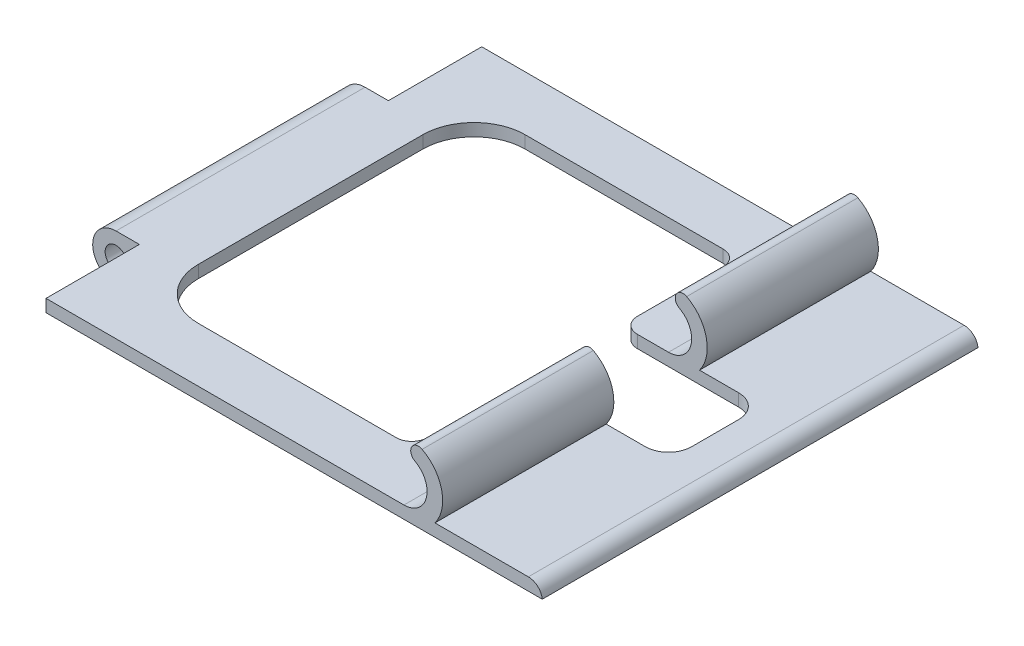
ISO-10303-21;
HEADER;
FILE_DESCRIPTION(('STEP AP214'),'2;1');
FILE_NAME('part.step','',(''),(''),'','','');
FILE_SCHEMA(('AUTOMOTIVE_DESIGN { 1 0 10303 214 1 1 1 1 }'));
ENDSEC;
DATA;
#1=APPLICATION_CONTEXT('core data for automotive mechanical design processes');
#2=APPLICATION_PROTOCOL_DEFINITION('international standard','automotive_design',2000,#1);
#3=PRODUCT_CONTEXT('',#1,'mechanical');
#4=PRODUCT('Part','Part','',(#3));
#5=PRODUCT_RELATED_PRODUCT_CATEGORY('part','',(#4));
#6=PRODUCT_DEFINITION_FORMATION('','',#4);
#7=PRODUCT_DEFINITION_CONTEXT('part definition',#1,'design');
#8=PRODUCT_DEFINITION('design','',#6,#7);
#9=PRODUCT_DEFINITION_SHAPE('','',#8);
#10=(LENGTH_UNIT() NAMED_UNIT(*) SI_UNIT(.MILLI.,.METRE.));
#11=(NAMED_UNIT(*) PLANE_ANGLE_UNIT() SI_UNIT($,.RADIAN.));
#12=(NAMED_UNIT(*) SI_UNIT($,.STERADIAN.) SOLID_ANGLE_UNIT());
#13=UNCERTAINTY_MEASURE_WITH_UNIT(LENGTH_MEASURE(1.E-05),#10,'distance_accuracy_value','');
#14=(GEOMETRIC_REPRESENTATION_CONTEXT(3) GLOBAL_UNCERTAINTY_ASSIGNED_CONTEXT((#13)) GLOBAL_UNIT_ASSIGNED_CONTEXT((#10,
#11,#12)) REPRESENTATION_CONTEXT('',''));
#15=CARTESIAN_POINT('',(0.,0.,0.));
#16=DIRECTION('',(0.,0.,1.));
#17=DIRECTION('',(1.,0.,0.));
#18=AXIS2_PLACEMENT_3D('',#15,#16,#17);
#19=CARTESIAN_POINT('',(115.,4.00000000000002,-140.));
#20=DIRECTION('',(0.,1.,0.));
#21=DIRECTION('',(-1.,0.,0.));
#22=AXIS2_PLACEMENT_3D('',#19,#20,#21);
#23=PLANE('',#22);
#24=DIRECTION('',(-1.,0.,0.));
#25=VECTOR('',#24,1.);
#26=CARTESIAN_POINT('',(115.,4.00000000000002,-85.));
#27=LINE('',#26,#25);
#28=CARTESIAN_POINT('',(115.,4.00000000000002,-85.));
#29=VERTEX_POINT('',#28);
#30=CARTESIAN_POINT('',(105.,4.00000000000001,-85.));
#31=VERTEX_POINT('',#30);
#32=EDGE_CURVE('E309',#29,#31,#27,.T.);
#33=ORIENTED_EDGE('',*,*,#32,.F.);
#34=DIRECTION('',(0.,0.,1.));
#35=VECTOR('',#34,1.);
#36=CARTESIAN_POINT('',(115.,4.00000000000002,-140.));
#37=LINE('',#36,#35);
#38=CARTESIAN_POINT('',(115.,4.00000000000002,-140.));
#39=VERTEX_POINT('',#38);
#40=EDGE_CURVE('E390',#39,#29,#37,.T.);
#41=ORIENTED_EDGE('',*,*,#40,.F.);
#42=DIRECTION('',(-1.,0.,0.));
#43=VECTOR('',#42,1.);
#44=CARTESIAN_POINT('',(0.,4.,-140.));
#45=LINE('',#44,#43);
#46=CARTESIAN_POINT('',(0.,4.,-140.));
#47=VERTEX_POINT('',#46);
#48=EDGE_CURVE('E350',#39,#47,#45,.T.);
#49=ORIENTED_EDGE('',*,*,#48,.T.);
#50=DIRECTION('',(0.,0.,1.));
#51=VECTOR('',#50,1.);
#52=CARTESIAN_POINT('',(0.,4.,-140.));
#53=LINE('',#52,#51);
#54=CARTESIAN_POINT('',(0.,3.99999999999999,-110.));
#55=VERTEX_POINT('',#54);
#56=EDGE_CURVE('E346',#47,#55,#53,.T.);
#57=ORIENTED_EDGE('',*,*,#56,.T.);
#58=DIRECTION('',(1.,0.,0.));
#59=VECTOR('',#58,1.);
#60=CARTESIAN_POINT('',(115.,4.00000000000002,-110.));
#61=LINE('',#60,#59);
#62=CARTESIAN_POINT('',(-7.5,4.,-110.));
#63=VERTEX_POINT('',#62);
#64=EDGE_CURVE('E326',#63,#55,#61,.T.);
#65=ORIENTED_EDGE('',*,*,#64,.F.);
#66=DIRECTION('',(0.,0.,1.));
#67=VECTOR('',#66,1.);
#68=CARTESIAN_POINT('',(-7.5,4.,-140.));
#69=LINE('',#68,#67);
#70=CARTESIAN_POINT('',(-7.5,4.,-30.));
#71=VERTEX_POINT('',#70);
#72=EDGE_CURVE('E371',#63,#71,#69,.T.);
#73=ORIENTED_EDGE('',*,*,#72,.T.);
#74=DIRECTION('',(-1.,0.,0.));
#75=VECTOR('',#74,1.);
#76=CARTESIAN_POINT('',(115.,4.00000000000002,-30.));
#77=LINE('',#76,#75);
#78=CARTESIAN_POINT('',(0.,3.99999999999999,-30.));
#79=VERTEX_POINT('',#78);
#80=EDGE_CURVE('E335',#79,#71,#77,.T.);
#81=ORIENTED_EDGE('',*,*,#80,.F.);
#82=DIRECTION('',(0.,0.,-1.));
#83=VECTOR('',#82,1.);
#84=CARTESIAN_POINT('',(0.,4.,-140.));
#85=LINE('',#84,#83);
#86=CARTESIAN_POINT('',(0.,4.00000000000001,0.));
#87=VERTEX_POINT('',#86);
#88=EDGE_CURVE('E341',#87,#79,#85,.T.);
#89=ORIENTED_EDGE('',*,*,#88,.F.);
#90=DIRECTION('',(-1.,0.,0.));
#91=VECTOR('',#90,1.);
#92=CARTESIAN_POINT('',(115.,4.00000000000002,0.));
#93=LINE('',#92,#91);
#94=CARTESIAN_POINT('',(115.,4.00000000000002,0.));
#95=VERTEX_POINT('',#94);
#96=EDGE_CURVE('E354',#95,#87,#93,.T.);
#97=ORIENTED_EDGE('',*,*,#96,.F.);
#98=CARTESIAN_POINT('',(115.,4.00000000000002,-55.));
#99=VERTEX_POINT('',#98);
#100=EDGE_CURVE('E394',#99,#95,#37,.T.);
#101=ORIENTED_EDGE('',*,*,#100,.F.);
#102=DIRECTION('',(1.,0.,0.));
#103=VECTOR('',#102,1.);
#104=CARTESIAN_POINT('',(115.,4.00000000000002,-55.));
#105=LINE('',#104,#103);
#106=CARTESIAN_POINT('',(105.,4.00000000000001,-55.));
#107=VERTEX_POINT('',#106);
#108=EDGE_CURVE('E292',#107,#99,#105,.T.);
#109=ORIENTED_EDGE('',*,*,#108,.F.);
#110=CARTESIAN_POINT('',(105.,4.00000000000002,-50.));
#111=DIRECTION('',(0.,1.,0.));
#112=DIRECTION('',(-1.,0.,0.));
#113=AXIS2_PLACEMENT_3D('',#110,#111,#112);
#114=CIRCLE('',#113,5.);
#115=CARTESIAN_POINT('',(100.,4.00000000000001,-50.));
#116=VERTEX_POINT('',#115);
#117=EDGE_CURVE('E283',#116,#107,#114,.F.);
#118=ORIENTED_EDGE('',*,*,#117,.F.);
#119=DIRECTION('',(0.,0.,-1.));
#120=VECTOR('',#119,1.);
#121=CARTESIAN_POINT('',(100.,4.00000000000002,-140.));
#122=LINE('',#121,#120);
#123=CARTESIAN_POINT('',(100.,4.00000000000001,-22.4400765317055));
#124=VERTEX_POINT('',#123);
#125=EDGE_CURVE('E281',#124,#116,#122,.T.);
#126=ORIENTED_EDGE('',*,*,#125,.F.);
#127=CARTESIAN_POINT('',(95.0599234682945,4.00000000000002,-22.4400765317055));
#128=DIRECTION('',(0.,1.,0.));
#129=DIRECTION('',(-1.,0.,0.));
#130=AXIS2_PLACEMENT_3D('',#127,#128,#129);
#131=CIRCLE('',#130,4.9400765317055);
#132=CARTESIAN_POINT('',(95.0599234682945,4.00000000000001,-17.5));
#133=VERTEX_POINT('',#132);
#134=EDGE_CURVE('E279',#133,#124,#131,.T.);
#135=ORIENTED_EDGE('',*,*,#134,.F.);
#136=DIRECTION('',(1.,0.,0.));
#137=VECTOR('',#136,1.);
#138=CARTESIAN_POINT('',(115.,4.00000000000002,-17.5));
#139=LINE('',#138,#137);
#140=CARTESIAN_POINT('',(31.4428038717873,4.,-17.5));
#141=VERTEX_POINT('',#140);
#142=EDGE_CURVE('E277',#141,#133,#139,.T.);
#143=ORIENTED_EDGE('',*,*,#142,.F.);
#144=CARTESIAN_POINT('',(31.4428038717873,4.00000000000001,-33.9428038717873));
#145=DIRECTION('',(0.,1.,0.));
#146=DIRECTION('',(-1.,0.,0.));
#147=AXIS2_PLACEMENT_3D('',#144,#145,#146);
#148=CIRCLE('',#147,16.4428038717873);
#149=CARTESIAN_POINT('',(15.,4.,-33.9428038717873));
#150=VERTEX_POINT('',#149);
#151=EDGE_CURVE('E275',#150,#141,#148,.T.);
#152=ORIENTED_EDGE('',*,*,#151,.F.);
#153=DIRECTION('',(0.,0.,1.));
#154=VECTOR('',#153,1.);
#155=CARTESIAN_POINT('',(15.,4.,-140.));
#156=LINE('',#155,#154);
#157=CARTESIAN_POINT('',(15.,4.,-106.057196128213));
#158=VERTEX_POINT('',#157);
#159=EDGE_CURVE('E273',#158,#150,#156,.T.);
#160=ORIENTED_EDGE('',*,*,#159,.F.);
#161=CARTESIAN_POINT('',(31.4428038717873,4.00000000000001,-106.057196128213));
#162=DIRECTION('',(0.,1.,0.));
#163=DIRECTION('',(-1.,0.,0.));
#164=AXIS2_PLACEMENT_3D('',#161,#162,#163);
#165=CIRCLE('',#164,16.4428038717873);
#166=CARTESIAN_POINT('',(31.4428038717873,4.00000000000001,-122.5));
#167=VERTEX_POINT('',#166);
#168=EDGE_CURVE('E271',#167,#158,#165,.T.);
#169=ORIENTED_EDGE('',*,*,#168,.F.);
#170=DIRECTION('',(-1.,0.,0.));
#171=VECTOR('',#170,1.);
#172=CARTESIAN_POINT('',(115.,4.00000000000002,-122.5));
#173=LINE('',#172,#171);
#174=CARTESIAN_POINT('',(95.0599234682945,4.00000000000001,-122.5));
#175=VERTEX_POINT('',#174);
#176=EDGE_CURVE('E266',#175,#167,#173,.T.);
#177=ORIENTED_EDGE('',*,*,#176,.F.);
#178=CARTESIAN_POINT('',(95.0599234682945,4.00000000000002,-117.559923468295));
#179=DIRECTION('',(0.,1.,0.));
#180=DIRECTION('',(-1.,0.,0.));
#181=AXIS2_PLACEMENT_3D('',#178,#179,#180);
#182=CIRCLE('',#181,4.9400765317055);
#183=CARTESIAN_POINT('',(100.,4.00000000000001,-117.559923468295));
#184=VERTEX_POINT('',#183);
#185=EDGE_CURVE('E264',#184,#175,#182,.T.);
#186=ORIENTED_EDGE('',*,*,#185,.F.);
#187=DIRECTION('',(0.,0.,-1.));
#188=VECTOR('',#187,1.);
#189=CARTESIAN_POINT('',(100.,4.00000000000002,-140.));
#190=LINE('',#189,#188);
#191=CARTESIAN_POINT('',(100.,4.00000000000001,-90.));
#192=VERTEX_POINT('',#191);
#193=EDGE_CURVE('E250',#192,#184,#190,.T.);
#194=ORIENTED_EDGE('',*,*,#193,.F.);
#195=CARTESIAN_POINT('',(105.,4.00000000000002,-90.));
#196=DIRECTION('',(0.,1.,0.));
#197=DIRECTION('',(-1.,0.,0.));
#198=AXIS2_PLACEMENT_3D('',#195,#196,#197);
#199=CIRCLE('',#198,5.);
#200=EDGE_CURVE('E243',#31,#192,#199,.F.);
#201=ORIENTED_EDGE('',*,*,#200,.F.);
#202=EDGE_LOOP('',(#33,#41,#49,#57,#65,#73,#81,#89,#97,#101,#109,#118,#126,#135,#143,#152,#160,
#169,#177,#186,#194,#201));
#203=FACE_BOUND('',#202,.T.);
#204=ADVANCED_FACE('F36',(#203),#23,.T.);
#205=CARTESIAN_POINT('',(115.,11.4375,-140.));
#206=DIRECTION('',(0.,0.,1.));
#207=DIRECTION('',(1.,0.,0.));
#208=AXIS2_PLACEMENT_3D('',#205,#206,#207);
#209=CYLINDRICAL_SURFACE('',#208,7.4375);
#210=CARTESIAN_POINT('',(115.,11.4375,-85.));
#211=DIRECTION('',(0.,0.,-1.));
#212=DIRECTION('',(-1.,0.,0.));
#213=AXIS2_PLACEMENT_3D('',#210,#211,#212);
#214=CIRCLE('',#213,7.4375);
#215=CARTESIAN_POINT('',(118.5,18.,-85.));
#216=VERTEX_POINT('',#215);
#217=EDGE_CURVE('E307',#216,#29,#214,.T.);
#218=ORIENTED_EDGE('',*,*,#217,.F.);
#219=DIRECTION('',(0.,0.,1.));
#220=VECTOR('',#219,1.);
#221=CARTESIAN_POINT('',(118.5,18.,-140.));
#222=LINE('',#221,#220);
#223=CARTESIAN_POINT('',(118.5,18.,-140.));
#224=VERTEX_POINT('',#223);
#225=EDGE_CURVE('E395',#224,#216,#222,.T.);
#226=ORIENTED_EDGE('',*,*,#225,.F.);
#227=CARTESIAN_POINT('',(115.,11.4375,-140.));
#228=DIRECTION('',(0.,0.,-1.));
#229=DIRECTION('',(1.,0.,0.));
#230=AXIS2_PLACEMENT_3D('',#227,#228,#229);
#231=CIRCLE('',#230,7.4375);
#232=EDGE_CURVE('E368',#224,#39,#231,.T.);
#233=ORIENTED_EDGE('',*,*,#232,.T.);
#234=ORIENTED_EDGE('',*,*,#40,.T.);
#235=EDGE_LOOP('',(#218,#226,#233,#234));
#236=FACE_BOUND('',#235,.T.);
#237=ADVANCED_FACE('F517',(#236),#209,.F.);
#238=CARTESIAN_POINT('',(119.676470588235,20.2058823529412,-140.));
#239=DIRECTION('',(0.,0.,1.));
#240=DIRECTION('',(1.,0.,0.));
#241=AXIS2_PLACEMENT_3D('',#238,#239,#240);
#242=CYLINDRICAL_SURFACE('',#241,2.5);
#243=DIRECTION('',(0.,0.,1.));
#244=VECTOR('',#243,1.);
#245=CARTESIAN_POINT('',(120.852941176471,22.4117647058824,-140.));
#246=LINE('',#245,#244);
#247=CARTESIAN_POINT('',(120.852941176471,22.4117647058824,-55.));
#248=VERTEX_POINT('',#247);
#249=CARTESIAN_POINT('',(120.852941176471,22.4117647058824,0.));
#250=VERTEX_POINT('',#249);
#251=EDGE_CURVE('E402',#248,#250,#246,.T.);
#252=ORIENTED_EDGE('',*,*,#251,.F.);
#253=CARTESIAN_POINT('',(119.676470588235,20.2058823529412,-55.));
#254=DIRECTION('',(0.,0.,1.));
#255=DIRECTION('',(1.,0.,0.));
#256=AXIS2_PLACEMENT_3D('',#253,#254,#255);
#257=CIRCLE('',#256,2.5);
#258=CARTESIAN_POINT('',(118.5,18.,-55.));
#259=VERTEX_POINT('',#258);
#260=EDGE_CURVE('E288',#259,#248,#257,.F.);
#261=ORIENTED_EDGE('',*,*,#260,.F.);
#262=CARTESIAN_POINT('',(118.5,18.,0.));
#263=VERTEX_POINT('',#262);
#264=EDGE_CURVE('E398',#259,#263,#222,.T.);
#265=ORIENTED_EDGE('',*,*,#264,.T.);
#266=CARTESIAN_POINT('',(119.676470588235,20.2058823529412,0.));
#267=DIRECTION('',(0.,0.,1.));
#268=DIRECTION('',(-1.,0.,0.));
#269=AXIS2_PLACEMENT_3D('',#266,#267,#268);
#270=CIRCLE('',#269,2.5);
#271=EDGE_CURVE('E382',#250,#263,#270,.T.);
#272=ORIENTED_EDGE('',*,*,#271,.F.);
#273=EDGE_LOOP('',(#252,#261,#265,#272));
#274=FACE_BOUND('',#273,.T.);
#275=ADVANCED_FACE('F621',(#274),#242,.T.);
#276=CARTESIAN_POINT('',(115.,11.4375,-140.));
#277=DIRECTION('',(0.,0.,1.));
#278=DIRECTION('',(1.,0.,0.));
#279=AXIS2_PLACEMENT_3D('',#276,#277,#278);
#280=CYLINDRICAL_SURFACE('',#279,12.4375);
#281=CARTESIAN_POINT('',(115.,11.4375,-85.));
#282=DIRECTION('',(0.,0.,-1.));
#283=DIRECTION('',(-1.,0.,0.));
#284=AXIS2_PLACEMENT_3D('',#281,#282,#283);
#285=CIRCLE('',#284,12.4375);
#286=CARTESIAN_POINT('',(124.968701018688,4.00000000000002,-85.));
#287=VERTEX_POINT('',#286);
#288=CARTESIAN_POINT('',(120.852941176471,22.4117647058824,-85.));
#289=VERTEX_POINT('',#288);
#290=EDGE_CURVE('E302',#287,#289,#285,.F.);
#291=ORIENTED_EDGE('',*,*,#290,.F.);
#292=DIRECTION('',(0.,0.,1.));
#293=VECTOR('',#292,1.);
#294=CARTESIAN_POINT('',(124.968701018688,4.00000000000003,-140.));
#295=LINE('',#294,#293);
#296=CARTESIAN_POINT('',(124.968701018688,4.00000000000003,-140.));
#297=VERTEX_POINT('',#296);
#298=EDGE_CURVE('E403',#297,#287,#295,.T.);
#299=ORIENTED_EDGE('',*,*,#298,.F.);
#300=CARTESIAN_POINT('',(115.,11.4375,-140.));
#301=DIRECTION('',(0.,0.,1.));
#302=DIRECTION('',(1.,0.,0.));
#303=AXIS2_PLACEMENT_3D('',#300,#301,#302);
#304=CIRCLE('',#303,12.4375);
#305=CARTESIAN_POINT('',(120.852941176471,22.4117647058824,-140.));
#306=VERTEX_POINT('',#305);
#307=EDGE_CURVE('E362',#297,#306,#304,.T.);
#308=ORIENTED_EDGE('',*,*,#307,.T.);
#309=EDGE_CURVE('E399',#306,#289,#246,.T.);
#310=ORIENTED_EDGE('',*,*,#309,.T.);
#311=EDGE_LOOP('',(#291,#299,#308,#310));
#312=FACE_BOUND('',#311,.T.);
#313=ADVANCED_FACE('F527',(#312),#280,.T.);
#314=CARTESIAN_POINT('',(115.,0.,-140.));
#315=DIRECTION('',(0.,-1.,0.));
#316=DIRECTION('',(0.,0.,-1.));
#317=AXIS2_PLACEMENT_3D('',#314,#315,#316);
#318=PLANE('',#317);
#319=DIRECTION('',(1.,0.,0.));
#320=VECTOR('',#319,1.);
#321=CARTESIAN_POINT('',(115.,0.,-30.));
#322=LINE('',#321,#320);
#323=CARTESIAN_POINT('',(-0.866750419289198,0.,-30.));
#324=VERTEX_POINT('',#323);
#325=CARTESIAN_POINT('',(0.,0.,-30.));
#326=VERTEX_POINT('',#325);
#327=EDGE_CURVE('E334',#324,#326,#322,.T.);
#328=ORIENTED_EDGE('',*,*,#327,.F.);
#329=DIRECTION('',(0.,0.,1.));
#330=VECTOR('',#329,1.);
#331=CARTESIAN_POINT('',(-0.8667504192892,0.,-140.));
#332=LINE('',#331,#330);
#333=CARTESIAN_POINT('',(-0.866750419289198,0.,-110.));
#334=VERTEX_POINT('',#333);
#335=EDGE_CURVE('E412',#334,#324,#332,.T.);
#336=ORIENTED_EDGE('',*,*,#335,.F.);
#337=DIRECTION('',(-1.,0.,0.));
#338=VECTOR('',#337,1.);
#339=CARTESIAN_POINT('',(115.,0.,-110.));
#340=LINE('',#339,#338);
#341=CARTESIAN_POINT('',(0.,0.,-110.));
#342=VERTEX_POINT('',#341);
#343=EDGE_CURVE('E327',#342,#334,#340,.T.);
#344=ORIENTED_EDGE('',*,*,#343,.F.);
#345=DIRECTION('',(0.,0.,-1.));
#346=VECTOR('',#345,1.);
#347=CARTESIAN_POINT('',(0.,0.,-140.));
#348=LINE('',#347,#346);
#349=CARTESIAN_POINT('',(0.,0.,-140.));
#350=VERTEX_POINT('',#349);
#351=EDGE_CURVE('E343',#342,#350,#348,.T.);
#352=ORIENTED_EDGE('',*,*,#351,.T.);
#353=DIRECTION('',(1.,0.,0.));
#354=VECTOR('',#353,1.);
#355=CARTESIAN_POINT('',(-0.8667504192892,0.,-140.));
#356=LINE('',#355,#354);
#357=CARTESIAN_POINT('',(159.44040119188,0.,-140.));
#358=VERTEX_POINT('',#357);
#359=EDGE_CURVE('E353',#350,#358,#356,.T.);
#360=ORIENTED_EDGE('',*,*,#359,.T.);
#361=DIRECTION('',(0.,0.,1.));
#362=VECTOR('',#361,1.);
#363=CARTESIAN_POINT('',(159.44040119188,0.,-140.));
#364=LINE('',#363,#362);
#365=CARTESIAN_POINT('',(159.44040119188,0.,0.));
#366=VERTEX_POINT('',#365);
#367=EDGE_CURVE('E409',#358,#366,#364,.T.);
#368=ORIENTED_EDGE('',*,*,#367,.T.);
#369=DIRECTION('',(1.,0.,0.));
#370=VECTOR('',#369,1.);
#371=CARTESIAN_POINT('',(115.,0.,0.));
#372=LINE('',#371,#370);
#373=CARTESIAN_POINT('',(0.,0.,0.));
#374=VERTEX_POINT('',#373);
#375=EDGE_CURVE('E349',#374,#366,#372,.T.);
#376=ORIENTED_EDGE('',*,*,#375,.F.);
#377=DIRECTION('',(0.,0.,1.));
#378=VECTOR('',#377,1.);
#379=CARTESIAN_POINT('',(0.,0.,-140.));
#380=LINE('',#379,#378);
#381=EDGE_CURVE('E339',#326,#374,#380,.T.);
#382=ORIENTED_EDGE('',*,*,#381,.F.);
#383=EDGE_LOOP('',(#328,#336,#344,#352,#360,#368,#376,#382));
#384=FACE_BOUND('',#383,.T.);
#385=DIRECTION('',(1.,0.,0.));
#386=VECTOR('',#385,1.);
#387=CARTESIAN_POINT('',(115.,0.,-85.));
#388=LINE('',#387,#386);
#389=CARTESIAN_POINT('',(105.,0.,-85.));
#390=VERTEX_POINT('',#389);
#391=CARTESIAN_POINT('',(137.571754820481,0.,-85.));
#392=VERTEX_POINT('',#391);
#393=EDGE_CURVE('E11',#390,#392,#388,.T.);
#394=ORIENTED_EDGE('',*,*,#393,.F.);
#395=CARTESIAN_POINT('',(105.,0.,-90.));
#396=DIRECTION('',(0.,-1.,0.));
#397=DIRECTION('',(0.,0.,-1.));
#398=AXIS2_PLACEMENT_3D('',#395,#396,#397);
#399=CIRCLE('',#398,5.);
#400=CARTESIAN_POINT('',(100.,0.,-90.));
#401=VERTEX_POINT('',#400);
#402=EDGE_CURVE('E393',#401,#390,#399,.F.);
#403=ORIENTED_EDGE('',*,*,#402,.F.);
#404=DIRECTION('',(0.,0.,1.));
#405=VECTOR('',#404,1.);
#406=CARTESIAN_POINT('',(100.,0.,-140.));
#407=LINE('',#406,#405);
#408=CARTESIAN_POINT('',(100.,0.,-117.559923468295));
#409=VERTEX_POINT('',#408);
#410=EDGE_CURVE('E258',#409,#401,#407,.T.);
#411=ORIENTED_EDGE('',*,*,#410,.F.);
#412=CARTESIAN_POINT('',(95.0599234682945,0.,-117.559923468295));
#413=DIRECTION('',(0.,-1.,0.));
#414=DIRECTION('',(0.,0.,-1.));
#415=AXIS2_PLACEMENT_3D('',#412,#413,#414);
#416=CIRCLE('',#415,4.9400765317055);
#417=CARTESIAN_POINT('',(95.0599234682945,0.,-122.5));
#418=VERTEX_POINT('',#417);
#419=EDGE_CURVE('E423',#418,#409,#416,.T.);
#420=ORIENTED_EDGE('',*,*,#419,.F.);
#421=DIRECTION('',(1.,0.,0.));
#422=VECTOR('',#421,1.);
#423=CARTESIAN_POINT('',(115.,0.,-122.5));
#424=LINE('',#423,#422);
#425=CARTESIAN_POINT('',(31.4428038717873,0.,-122.5));
#426=VERTEX_POINT('',#425);
#427=EDGE_CURVE('E425',#426,#418,#424,.T.);
#428=ORIENTED_EDGE('',*,*,#427,.F.);
#429=CARTESIAN_POINT('',(31.4428038717873,0.,-106.057196128213));
#430=DIRECTION('',(0.,-1.,0.));
#431=DIRECTION('',(0.,0.,-1.));
#432=AXIS2_PLACEMENT_3D('',#429,#430,#431);
#433=CIRCLE('',#432,16.4428038717873);
#434=CARTESIAN_POINT('',(15.,0.,-106.057196128213));
#435=VERTEX_POINT('',#434);
#436=EDGE_CURVE('E427',#435,#426,#433,.T.);
#437=ORIENTED_EDGE('',*,*,#436,.F.);
#438=DIRECTION('',(0.,0.,-1.));
#439=VECTOR('',#438,1.);
#440=CARTESIAN_POINT('',(15.,0.,-140.));
#441=LINE('',#440,#439);
#442=CARTESIAN_POINT('',(15.,0.,-33.9428038717873));
#443=VERTEX_POINT('',#442);
#444=EDGE_CURVE('E429',#443,#435,#441,.T.);
#445=ORIENTED_EDGE('',*,*,#444,.F.);
#446=CARTESIAN_POINT('',(31.4428038717873,0.,-33.9428038717873));
#447=DIRECTION('',(0.,-1.,0.));
#448=DIRECTION('',(0.,0.,-1.));
#449=AXIS2_PLACEMENT_3D('',#446,#447,#448);
#450=CIRCLE('',#449,16.4428038717873);
#451=CARTESIAN_POINT('',(31.4428038717873,0.,-17.5));
#452=VERTEX_POINT('',#451);
#453=EDGE_CURVE('E431',#452,#443,#450,.T.);
#454=ORIENTED_EDGE('',*,*,#453,.F.);
#455=DIRECTION('',(-1.,0.,0.));
#456=VECTOR('',#455,1.);
#457=CARTESIAN_POINT('',(115.,0.,-17.5));
#458=LINE('',#457,#456);
#459=CARTESIAN_POINT('',(95.0599234682945,0.,-17.5));
#460=VERTEX_POINT('',#459);
#461=EDGE_CURVE('E433',#460,#452,#458,.T.);
#462=ORIENTED_EDGE('',*,*,#461,.F.);
#463=CARTESIAN_POINT('',(95.0599234682945,0.,-22.4400765317055));
#464=DIRECTION('',(0.,-1.,0.));
#465=DIRECTION('',(0.,0.,-1.));
#466=AXIS2_PLACEMENT_3D('',#463,#464,#465);
#467=CIRCLE('',#466,4.9400765317055);
#468=CARTESIAN_POINT('',(100.,0.,-22.4400765317055));
#469=VERTEX_POINT('',#468);
#470=EDGE_CURVE('E435',#469,#460,#467,.T.);
#471=ORIENTED_EDGE('',*,*,#470,.F.);
#472=DIRECTION('',(0.,0.,1.));
#473=VECTOR('',#472,1.);
#474=CARTESIAN_POINT('',(100.,0.,-140.));
#475=LINE('',#474,#473);
#476=CARTESIAN_POINT('',(100.,0.,-50.));
#477=VERTEX_POINT('',#476);
#478=EDGE_CURVE('E437',#477,#469,#475,.T.);
#479=ORIENTED_EDGE('',*,*,#478,.F.);
#480=CARTESIAN_POINT('',(105.,0.,-50.));
#481=DIRECTION('',(0.,-1.,0.));
#482=DIRECTION('',(0.,0.,-1.));
#483=AXIS2_PLACEMENT_3D('',#480,#481,#482);
#484=CIRCLE('',#483,5.);
#485=CARTESIAN_POINT('',(105.,0.,-55.));
#486=VERTEX_POINT('',#485);
#487=EDGE_CURVE('E439',#486,#477,#484,.F.);
#488=ORIENTED_EDGE('',*,*,#487,.F.);
#489=DIRECTION('',(-1.,0.,0.));
#490=VECTOR('',#489,1.);
#491=CARTESIAN_POINT('',(115.,0.,-55.));
#492=LINE('',#491,#490);
#493=CARTESIAN_POINT('',(137.571754820481,0.,-55.));
#494=VERTEX_POINT('',#493);
#495=EDGE_CURVE('E441',#494,#486,#492,.T.);
#496=ORIENTED_EDGE('',*,*,#495,.F.);
#497=CARTESIAN_POINT('',(137.571754820481,0.,-62.4282451795186));
#498=DIRECTION('',(0.,-1.,0.));
#499=DIRECTION('',(0.,0.,-1.));
#500=AXIS2_PLACEMENT_3D('',#497,#498,#499);
#501=CIRCLE('',#500,7.42824517951862);
#502=CARTESIAN_POINT('',(145.,0.,-62.4282451795186));
#503=VERTEX_POINT('',#502);
#504=EDGE_CURVE('E443',#503,#494,#501,.T.);
#505=ORIENTED_EDGE('',*,*,#504,.F.);
#506=DIRECTION('',(0.,0.,1.));
#507=VECTOR('',#506,1.);
#508=CARTESIAN_POINT('',(145.,0.,-140.));
#509=LINE('',#508,#507);
#510=CARTESIAN_POINT('',(145.,0.,-77.5717548204814));
#511=VERTEX_POINT('',#510);
#512=EDGE_CURVE('E445',#511,#503,#509,.T.);
#513=ORIENTED_EDGE('',*,*,#512,.F.);
#514=CARTESIAN_POINT('',(137.571754820481,0.,-77.5717548204814));
#515=DIRECTION('',(0.,-1.,0.));
#516=DIRECTION('',(0.,0.,-1.));
#517=AXIS2_PLACEMENT_3D('',#514,#515,#516);
#518=CIRCLE('',#517,7.42824517951862);
#519=EDGE_CURVE('E44',#392,#511,#518,.T.);
#520=ORIENTED_EDGE('',*,*,#519,.F.);
#521=EDGE_LOOP('',(#394,#403,#411,#420,#428,#437,#445,#454,#462,#471,#479,#488,#496,#505,#513,#520));
#522=FACE_BOUND('',#521,.T.);
#523=ADVANCED_FACE('F466',(#384,#522),#318,.T.);
#524=CARTESIAN_POINT('',(-7.5,-3.5,-140.));
#525=DIRECTION('',(0.,0.,1.));
#526=DIRECTION('',(1.,0.,0.));
#527=AXIS2_PLACEMENT_3D('',#524,#525,#526);
#528=PLANE('',#527);
#529=DIRECTION('',(0.,1.,0.));
#530=VECTOR('',#529,1.);
#531=CARTESIAN_POINT('',(0.,11.5,-140.));
#532=LINE('',#531,#530);
#533=EDGE_CURVE('E311',#350,#47,#532,.T.);
#534=ORIENTED_EDGE('',*,*,#533,.T.);
#535=ORIENTED_EDGE('',*,*,#48,.F.);
#536=ORIENTED_EDGE('',*,*,#232,.F.);
#537=CARTESIAN_POINT('',(119.676470588235,20.2058823529412,-140.));
#538=DIRECTION('',(0.,0.,1.));
#539=DIRECTION('',(-1.,0.,0.));
#540=AXIS2_PLACEMENT_3D('',#537,#538,#539);
#541=CIRCLE('',#540,2.5);
#542=EDGE_CURVE('E365',#306,#224,#541,.T.);
#543=ORIENTED_EDGE('',*,*,#542,.F.);
#544=ORIENTED_EDGE('',*,*,#307,.F.);
#545=DIRECTION('',(-1.,0.,0.));
#546=VECTOR('',#545,1.);
#547=CARTESIAN_POINT('',(154.968701018688,4.00000000000003,-140.));
#548=LINE('',#547,#546);
#549=CARTESIAN_POINT('',(154.968701018688,4.00000000000003,-140.));
#550=VERTEX_POINT('',#549);
#551=EDGE_CURVE('E359',#550,#297,#548,.T.);
#552=ORIENTED_EDGE('',*,*,#551,.F.);
#553=CARTESIAN_POINT('',(154.968701018688,-0.499512804865437,-140.));
#554=DIRECTION('',(0.,0.,1.));
#555=DIRECTION('',(-1.,0.,0.));
#556=AXIS2_PLACEMENT_3D('',#553,#554,#555);
#557=CIRCLE('',#556,4.49951280486546);
#558=EDGE_CURVE('E356',#358,#550,#557,.T.);
#559=ORIENTED_EDGE('',*,*,#558,.F.);
#560=ORIENTED_EDGE('',*,*,#359,.F.);
#561=EDGE_LOOP('',(#534,#535,#536,#543,#544,#552,#559,#560));
#562=FACE_BOUND('',#561,.T.);
#563=ADVANCED_FACE('F521',(#562),#528,.F.);
#564=CARTESIAN_POINT('',(115.,11.4375,-55.));
#565=DIRECTION('',(0.,0.,1.));
#566=DIRECTION('',(1.,0.,0.));
#567=AXIS2_PLACEMENT_3D('',#564,#565,#566);
#568=CIRCLE('',#567,7.4375);
#569=EDGE_CURVE('E290',#99,#259,#568,.T.);
#570=ORIENTED_EDGE('',*,*,#569,.F.);
#571=ORIENTED_EDGE('',*,*,#100,.T.);
#572=CARTESIAN_POINT('',(115.,11.4375,0.));
#573=DIRECTION('',(0.,0.,-1.));
#574=DIRECTION('',(1.,0.,0.));
#575=AXIS2_PLACEMENT_3D('',#572,#573,#574);
#576=CIRCLE('',#575,7.4375);
#577=EDGE_CURVE('E385',#263,#95,#576,.T.);
#578=ORIENTED_EDGE('',*,*,#577,.F.);
#579=ORIENTED_EDGE('',*,*,#264,.F.);
#580=EDGE_LOOP('',(#570,#571,#578,#579));
#581=FACE_BOUND('',#580,.T.);
#582=ADVANCED_FACE('F569',(#581),#209,.F.);
#583=CARTESIAN_POINT('',(119.676470588235,20.2058823529412,-85.));
#584=DIRECTION('',(0.,0.,-1.));
#585=DIRECTION('',(-1.,0.,0.));
#586=AXIS2_PLACEMENT_3D('',#583,#584,#585);
#587=CIRCLE('',#586,2.5);
#588=EDGE_CURVE('E305',#289,#216,#587,.F.);
#589=ORIENTED_EDGE('',*,*,#588,.F.);
#590=ORIENTED_EDGE('',*,*,#309,.F.);
#591=ORIENTED_EDGE('',*,*,#542,.T.);
#592=ORIENTED_EDGE('',*,*,#225,.T.);
#593=EDGE_LOOP('',(#589,#590,#591,#592));
#594=FACE_BOUND('',#593,.T.);
#595=ADVANCED_FACE('F524',(#594),#242,.T.);
#596=CARTESIAN_POINT('',(115.,11.4375,-55.));
#597=DIRECTION('',(0.,0.,1.));
#598=DIRECTION('',(1.,0.,0.));
#599=AXIS2_PLACEMENT_3D('',#596,#597,#598);
#600=CIRCLE('',#599,12.4375);
#601=CARTESIAN_POINT('',(124.968701018688,4.00000000000003,-55.));
#602=VERTEX_POINT('',#601);
#603=EDGE_CURVE('E51',#248,#602,#600,.F.);
#604=ORIENTED_EDGE('',*,*,#603,.F.);
#605=ORIENTED_EDGE('',*,*,#251,.T.);
#606=CARTESIAN_POINT('',(115.,11.4375,0.));
#607=DIRECTION('',(0.,0.,1.));
#608=DIRECTION('',(1.,0.,0.));
#609=AXIS2_PLACEMENT_3D('',#606,#607,#608);
#610=CIRCLE('',#609,12.4375);
#611=CARTESIAN_POINT('',(124.968701018688,4.00000000000003,0.));
#612=VERTEX_POINT('',#611);
#613=EDGE_CURVE('E379',#612,#250,#610,.T.);
#614=ORIENTED_EDGE('',*,*,#613,.F.);
#615=EDGE_CURVE('E406',#602,#612,#295,.T.);
#616=ORIENTED_EDGE('',*,*,#615,.F.);
#617=EDGE_LOOP('',(#604,#605,#614,#616));
#618=FACE_BOUND('',#617,.T.);
#619=ADVANCED_FACE('F629',(#618),#280,.T.);
#620=CARTESIAN_POINT('',(154.968701018688,4.00000000000003,-140.));
#621=DIRECTION('',(0.,1.,0.));
#622=DIRECTION('',(-1.,0.,0.));
#623=AXIS2_PLACEMENT_3D('',#620,#621,#622);
#624=PLANE('',#623);
#625=DIRECTION('',(-1.,0.,0.));
#626=VECTOR('',#625,1.);
#627=CARTESIAN_POINT('',(154.968701018688,4.00000000000003,-85.));
#628=LINE('',#627,#626);
#629=CARTESIAN_POINT('',(137.571754820481,4.00000000000002,-85.));
#630=VERTEX_POINT('',#629);
#631=EDGE_CURVE('E300',#630,#287,#628,.T.);
#632=ORIENTED_EDGE('',*,*,#631,.F.);
#633=CARTESIAN_POINT('',(137.571754820481,4.00000000000002,-77.5717548204814));
#634=DIRECTION('',(0.,1.,0.));
#635=DIRECTION('',(-1.,0.,0.));
#636=AXIS2_PLACEMENT_3D('',#633,#634,#635);
#637=CIRCLE('',#636,7.42824517951862);
#638=CARTESIAN_POINT('',(145.,4.00000000000002,-77.5717548204814));
#639=VERTEX_POINT('',#638);
#640=EDGE_CURVE('E298',#639,#630,#637,.T.);
#641=ORIENTED_EDGE('',*,*,#640,.F.);
#642=DIRECTION('',(0.,0.,-1.));
#643=VECTOR('',#642,1.);
#644=CARTESIAN_POINT('',(145.,4.00000000000002,-140.));
#645=LINE('',#644,#643);
#646=CARTESIAN_POINT('',(145.,4.00000000000002,-62.4282451795186));
#647=VERTEX_POINT('',#646);
#648=EDGE_CURVE('E296',#647,#639,#645,.T.);
#649=ORIENTED_EDGE('',*,*,#648,.F.);
#650=CARTESIAN_POINT('',(137.571754820481,4.00000000000002,-62.4282451795186));
#651=DIRECTION('',(0.,1.,0.));
#652=DIRECTION('',(-1.,0.,0.));
#653=AXIS2_PLACEMENT_3D('',#650,#651,#652);
#654=CIRCLE('',#653,7.42824517951862);
#655=CARTESIAN_POINT('',(137.571754820481,4.00000000000002,-55.));
#656=VERTEX_POINT('',#655);
#657=EDGE_CURVE('E294',#656,#647,#654,.T.);
#658=ORIENTED_EDGE('',*,*,#657,.F.);
#659=DIRECTION('',(1.,0.,0.));
#660=VECTOR('',#659,1.);
#661=CARTESIAN_POINT('',(154.968701018688,4.00000000000003,-55.));
#662=LINE('',#661,#660);
#663=EDGE_CURVE('E285',#602,#656,#662,.T.);
#664=ORIENTED_EDGE('',*,*,#663,.F.);
#665=ORIENTED_EDGE('',*,*,#615,.T.);
#666=DIRECTION('',(-1.,0.,0.));
#667=VECTOR('',#666,1.);
#668=CARTESIAN_POINT('',(154.968701018688,4.00000000000003,0.));
#669=LINE('',#668,#667);
#670=CARTESIAN_POINT('',(154.968701018688,4.00000000000003,0.));
#671=VERTEX_POINT('',#670);
#672=EDGE_CURVE('E376',#671,#612,#669,.T.);
#673=ORIENTED_EDGE('',*,*,#672,.F.);
#674=DIRECTION('',(0.,0.,1.));
#675=VECTOR('',#674,1.);
#676=CARTESIAN_POINT('',(154.968701018688,4.00000000000003,-140.));
#677=LINE('',#676,#675);
#678=EDGE_CURVE('E407',#550,#671,#677,.T.);
#679=ORIENTED_EDGE('',*,*,#678,.F.);
#680=ORIENTED_EDGE('',*,*,#551,.T.);
#681=ORIENTED_EDGE('',*,*,#298,.T.);
#682=EDGE_LOOP('',(#632,#641,#649,#658,#664,#665,#673,#679,#680,#681));
#683=FACE_BOUND('',#682,.T.);
#684=ADVANCED_FACE('F532',(#683),#624,.T.);
#685=CARTESIAN_POINT('',(154.968701018688,-0.499512804865437,-140.));
#686=DIRECTION('',(0.,0.,1.));
#687=DIRECTION('',(1.,0.,0.));
#688=AXIS2_PLACEMENT_3D('',#685,#686,#687);
#689=CYLINDRICAL_SURFACE('',#688,4.49951280486546);
#690=CARTESIAN_POINT('',(154.968701018688,-0.499512804865437,0.));
#691=DIRECTION('',(0.,0.,1.));
#692=DIRECTION('',(-1.,0.,0.));
#693=AXIS2_PLACEMENT_3D('',#690,#691,#692);
#694=CIRCLE('',#693,4.49951280486546);
#695=EDGE_CURVE('E373',#366,#671,#694,.T.);
#696=ORIENTED_EDGE('',*,*,#695,.F.);
#697=ORIENTED_EDGE('',*,*,#367,.F.);
#698=ORIENTED_EDGE('',*,*,#558,.T.);
#699=ORIENTED_EDGE('',*,*,#678,.T.);
#700=EDGE_LOOP('',(#696,#697,#698,#699));
#701=FACE_BOUND('',#700,.T.);
#702=ADVANCED_FACE('F536',(#701),#689,.T.);
#703=CARTESIAN_POINT('',(-7.5,-3.5,-140.));
#704=DIRECTION('',(0.,0.,1.));
#705=DIRECTION('',(1.,0.,0.));
#706=AXIS2_PLACEMENT_3D('',#703,#704,#705);
#707=CYLINDRICAL_SURFACE('',#706,7.5);
#708=CARTESIAN_POINT('',(-7.5,-3.5,-30.));
#709=DIRECTION('',(0.,0.,-1.));
#710=DIRECTION('',(-1.,0.,0.));
#711=AXIS2_PLACEMENT_3D('',#708,#709,#710);
#712=CIRCLE('',#711,7.5);
#713=EDGE_CURVE('E332',#71,#324,#712,.F.);
#714=ORIENTED_EDGE('',*,*,#713,.F.);
#715=ORIENTED_EDGE('',*,*,#72,.F.);
#716=CARTESIAN_POINT('',(-7.5,-3.5,-110.));
#717=DIRECTION('',(0.,0.,1.));
#718=DIRECTION('',(1.,0.,0.));
#719=AXIS2_PLACEMENT_3D('',#716,#717,#718);
#720=CIRCLE('',#719,7.5);
#721=EDGE_CURVE('E324',#334,#63,#720,.F.);
#722=ORIENTED_EDGE('',*,*,#721,.F.);
#723=ORIENTED_EDGE('',*,*,#335,.T.);
#724=EDGE_LOOP('',(#714,#715,#722,#723));
#725=FACE_BOUND('',#724,.T.);
#726=ADVANCED_FACE('F38',(#725),#707,.T.);
#727=CARTESIAN_POINT('',(-7.5,-3.5,0.));
#728=DIRECTION('',(0.,0.,1.));
#729=DIRECTION('',(1.,0.,0.));
#730=AXIS2_PLACEMENT_3D('',#727,#728,#729);
#731=PLANE('',#730);
#732=DIRECTION('',(0.,-1.,0.));
#733=VECTOR('',#732,1.);
#734=CARTESIAN_POINT('',(0.,11.5,0.));
#735=LINE('',#734,#733);
#736=EDGE_CURVE('E312',#87,#374,#735,.T.);
#737=ORIENTED_EDGE('',*,*,#736,.T.);
#738=ORIENTED_EDGE('',*,*,#375,.T.);
#739=ORIENTED_EDGE('',*,*,#695,.T.);
#740=ORIENTED_EDGE('',*,*,#672,.T.);
#741=ORIENTED_EDGE('',*,*,#613,.T.);
#742=ORIENTED_EDGE('',*,*,#271,.T.);
#743=ORIENTED_EDGE('',*,*,#577,.T.);
#744=ORIENTED_EDGE('',*,*,#96,.T.);
#745=EDGE_LOOP('',(#737,#738,#739,#740,#741,#742,#743,#744));
#746=FACE_BOUND('',#745,.T.);
#747=ADVANCED_FACE('F563',(#746),#731,.T.);
#748=CARTESIAN_POINT('',(-15.,-15.8449250941288,-110.));
#749=DIRECTION('',(0.,0.,1.));
#750=DIRECTION('',(1.,0.,0.));
#751=AXIS2_PLACEMENT_3D('',#748,#749,#750);
#752=PLANE('',#751);
#753=ORIENTED_EDGE('',*,*,#64,.T.);
#754=DIRECTION('',(0.,-1.,0.));
#755=VECTOR('',#754,1.);
#756=CARTESIAN_POINT('',(0.,-15.8449250941288,-110.));
#757=LINE('',#756,#755);
#758=EDGE_CURVE('E316',#55,#342,#757,.T.);
#759=ORIENTED_EDGE('',*,*,#758,.T.);
#760=ORIENTED_EDGE('',*,*,#343,.T.);
#761=ORIENTED_EDGE('',*,*,#721,.T.);
#762=EDGE_LOOP('',(#753,#759,#760,#761));
#763=FACE_BOUND('',#762,.T.);
#764=CARTESIAN_POINT('',(-7.5,-3.5,-110.));
#765=DIRECTION('',(0.,0.,1.));
#766=DIRECTION('',(1.,0.,0.));
#767=AXIS2_PLACEMENT_3D('',#764,#765,#766);
#768=CIRCLE('',#767,3.5);
#769=CARTESIAN_POINT('',(-4.,-3.5,-110.));
#770=VERTEX_POINT('',#769);
#771=EDGE_CURVE('E319',#770,#770,#768,.F.);
#772=ORIENTED_EDGE('',*,*,#771,.F.);
#773=EDGE_LOOP('',(#772));
#774=FACE_BOUND('',#773,.T.);
#775=ADVANCED_FACE('F548',(#763,#774),#752,.F.);
#776=CARTESIAN_POINT('',(0.,0.,0.));
#777=DIRECTION('',(-1.,0.,0.));
#778=DIRECTION('',(0.,-1.,0.));
#779=AXIS2_PLACEMENT_3D('',#776,#777,#778);
#780=PLANE('',#779);
#781=ORIENTED_EDGE('',*,*,#533,.F.);
#782=ORIENTED_EDGE('',*,*,#351,.F.);
#783=ORIENTED_EDGE('',*,*,#758,.F.);
#784=ORIENTED_EDGE('',*,*,#56,.F.);
#785=EDGE_LOOP('',(#781,#782,#783,#784));
#786=FACE_BOUND('',#785,.T.);
#787=ADVANCED_FACE('F546',(#786),#780,.T.);
#788=CARTESIAN_POINT('',(0.,0.,0.));
#789=DIRECTION('',(1.,0.,0.));
#790=DIRECTION('',(0.,1.,0.));
#791=AXIS2_PLACEMENT_3D('',#788,#789,#790);
#792=PLANE('',#791);
#793=ORIENTED_EDGE('',*,*,#88,.T.);
#794=DIRECTION('',(0.,1.,0.));
#795=VECTOR('',#794,1.);
#796=CARTESIAN_POINT('',(0.,-15.8449250941288,-30.));
#797=LINE('',#796,#795);
#798=EDGE_CURVE('E315',#326,#79,#797,.T.);
#799=ORIENTED_EDGE('',*,*,#798,.F.);
#800=ORIENTED_EDGE('',*,*,#381,.T.);
#801=ORIENTED_EDGE('',*,*,#736,.F.);
#802=EDGE_LOOP('',(#793,#799,#800,#801));
#803=FACE_BOUND('',#802,.T.);
#804=ADVANCED_FACE('F652',(#803),#792,.F.);
#805=CARTESIAN_POINT('',(-15.,-15.8449250941288,-30.));
#806=DIRECTION('',(0.,0.,-1.));
#807=DIRECTION('',(-1.,0.,0.));
#808=AXIS2_PLACEMENT_3D('',#805,#806,#807);
#809=PLANE('',#808);
#810=ORIENTED_EDGE('',*,*,#327,.T.);
#811=ORIENTED_EDGE('',*,*,#798,.T.);
#812=ORIENTED_EDGE('',*,*,#80,.T.);
#813=ORIENTED_EDGE('',*,*,#713,.T.);
#814=EDGE_LOOP('',(#810,#811,#812,#813));
#815=FACE_BOUND('',#814,.T.);
#816=CARTESIAN_POINT('',(-7.5,-3.5,-30.));
#817=DIRECTION('',(0.,0.,-1.));
#818=DIRECTION('',(-1.,0.,0.));
#819=AXIS2_PLACEMENT_3D('',#816,#817,#818);
#820=CIRCLE('',#819,3.5);
#821=CARTESIAN_POINT('',(-11.,-3.5,-30.));
#822=VERTEX_POINT('',#821);
#823=EDGE_CURVE('E331',#822,#822,#820,.F.);
#824=ORIENTED_EDGE('',*,*,#823,.F.);
#825=EDGE_LOOP('',(#824));
#826=FACE_BOUND('',#825,.T.);
#827=ADVANCED_FACE('F555',(#815,#826),#809,.F.);
#828=CARTESIAN_POINT('',(-7.5,-3.5,-140.));
#829=DIRECTION('',(0.,0.,1.));
#830=DIRECTION('',(1.,0.,0.));
#831=AXIS2_PLACEMENT_3D('',#828,#829,#830);
#832=CYLINDRICAL_SURFACE('',#831,3.5);
#833=ORIENTED_EDGE('',*,*,#823,.T.);
#834=EDGE_LOOP('',(#833));
#835=FACE_BOUND('',#834,.T.);
#836=ORIENTED_EDGE('',*,*,#771,.T.);
#837=EDGE_LOOP('',(#836));
#838=FACE_BOUND('',#837,.T.);
#839=ADVANCED_FACE('F659',(#835,#838),#832,.F.);
#840=CARTESIAN_POINT('',(115.,-11.,-85.));
#841=DIRECTION('',(0.,0.,-1.));
#842=DIRECTION('',(-1.,0.,0.));
#843=AXIS2_PLACEMENT_3D('',#840,#841,#842);
#844=PLANE('',#843);
#845=ORIENTED_EDGE('',*,*,#32,.T.);
#846=DIRECTION('',(0.,1.,0.));
#847=VECTOR('',#846,1.);
#848=CARTESIAN_POINT('',(105.,-11.,-85.));
#849=LINE('',#848,#847);
#850=EDGE_CURVE('E246',#390,#31,#849,.T.);
#851=ORIENTED_EDGE('',*,*,#850,.F.);
#852=ORIENTED_EDGE('',*,*,#393,.T.);
#853=DIRECTION('',(0.,1.,0.));
#854=VECTOR('',#853,1.);
#855=CARTESIAN_POINT('',(137.571754820481,-11.,-85.));
#856=LINE('',#855,#854);
#857=EDGE_CURVE('E251',#392,#630,#856,.T.);
#858=ORIENTED_EDGE('',*,*,#857,.T.);
#859=ORIENTED_EDGE('',*,*,#631,.T.);
#860=ORIENTED_EDGE('',*,*,#290,.T.);
#861=ORIENTED_EDGE('',*,*,#588,.T.);
#862=ORIENTED_EDGE('',*,*,#217,.T.);
#863=EDGE_LOOP('',(#845,#851,#852,#858,#859,#860,#861,#862));
#864=FACE_BOUND('',#863,.T.);
#865=ADVANCED_FACE('F513',(#864),#844,.F.);
#866=CARTESIAN_POINT('',(137.571754820481,-11.,-77.5717548204814));
#867=DIRECTION('',(0.,1.,0.));
#868=DIRECTION('',(-1.,0.,0.));
#869=AXIS2_PLACEMENT_3D('',#866,#867,#868);
#870=CYLINDRICAL_SURFACE('',#869,7.42824517951862);
#871=ORIENTED_EDGE('',*,*,#640,.T.);
#872=ORIENTED_EDGE('',*,*,#857,.F.);
#873=ORIENTED_EDGE('',*,*,#519,.T.);
#874=DIRECTION('',(0.,1.,0.));
#875=VECTOR('',#874,1.);
#876=CARTESIAN_POINT('',(145.,-11.,-77.5717548204814));
#877=LINE('',#876,#875);
#878=EDGE_CURVE('E452',#511,#639,#877,.T.);
#879=ORIENTED_EDGE('',*,*,#878,.T.);
#880=EDGE_LOOP('',(#871,#872,#873,#879));
#881=FACE_BOUND('',#880,.T.);
#882=ADVANCED_FACE('F451',(#881),#870,.F.);
#883=CARTESIAN_POINT('',(145.,-11.,-77.5717548204814));
#884=DIRECTION('',(1.,0.,0.));
#885=DIRECTION('',(0.,1.,0.));
#886=AXIS2_PLACEMENT_3D('',#883,#884,#885);
#887=PLANE('',#886);
#888=ORIENTED_EDGE('',*,*,#648,.T.);
#889=ORIENTED_EDGE('',*,*,#878,.F.);
#890=ORIENTED_EDGE('',*,*,#512,.T.);
#891=DIRECTION('',(0.,1.,0.));
#892=VECTOR('',#891,1.);
#893=CARTESIAN_POINT('',(145.,-11.,-62.4282451795186));
#894=LINE('',#893,#892);
#895=EDGE_CURVE('E463',#503,#647,#894,.T.);
#896=ORIENTED_EDGE('',*,*,#895,.T.);
#897=EDGE_LOOP('',(#888,#889,#890,#896));
#898=FACE_BOUND('',#897,.T.);
#899=ADVANCED_FACE('F459',(#898),#887,.F.);
#900=CARTESIAN_POINT('',(137.571754820481,-11.,-62.4282451795186));
#901=DIRECTION('',(0.,1.,0.));
#902=DIRECTION('',(-1.,0.,0.));
#903=AXIS2_PLACEMENT_3D('',#900,#901,#902);
#904=CYLINDRICAL_SURFACE('',#903,7.42824517951862);
#905=ORIENTED_EDGE('',*,*,#657,.T.);
#906=ORIENTED_EDGE('',*,*,#895,.F.);
#907=ORIENTED_EDGE('',*,*,#504,.T.);
#908=DIRECTION('',(0.,1.,0.));
#909=VECTOR('',#908,1.);
#910=CARTESIAN_POINT('',(137.571754820481,-11.,-55.));
#911=LINE('',#910,#909);
#912=EDGE_CURVE('E473',#494,#656,#911,.T.);
#913=ORIENTED_EDGE('',*,*,#912,.T.);
#914=EDGE_LOOP('',(#905,#906,#907,#913));
#915=FACE_BOUND('',#914,.T.);
#916=ADVANCED_FACE('F472',(#915),#904,.F.);
#917=CARTESIAN_POINT('',(137.571754820481,-11.,-55.));
#918=DIRECTION('',(0.,0.,1.));
#919=DIRECTION('',(1.,0.,0.));
#920=AXIS2_PLACEMENT_3D('',#917,#918,#919);
#921=PLANE('',#920);
#922=ORIENTED_EDGE('',*,*,#108,.T.);
#923=ORIENTED_EDGE('',*,*,#569,.T.);
#924=ORIENTED_EDGE('',*,*,#260,.T.);
#925=ORIENTED_EDGE('',*,*,#603,.T.);
#926=ORIENTED_EDGE('',*,*,#663,.T.);
#927=ORIENTED_EDGE('',*,*,#912,.F.);
#928=ORIENTED_EDGE('',*,*,#495,.T.);
#929=DIRECTION('',(0.,1.,0.));
#930=VECTOR('',#929,1.);
#931=CARTESIAN_POINT('',(105.,-11.,-55.));
#932=LINE('',#931,#930);
#933=EDGE_CURVE('E478',#486,#107,#932,.T.);
#934=ORIENTED_EDGE('',*,*,#933,.T.);
#935=EDGE_LOOP('',(#922,#923,#924,#925,#926,#927,#928,#934));
#936=FACE_BOUND('',#935,.T.);
#937=ADVANCED_FACE('F475',(#936),#921,.F.);
#938=CARTESIAN_POINT('',(105.,-11.,-50.));
#939=DIRECTION('',(0.,1.,0.));
#940=DIRECTION('',(-1.,0.,0.));
#941=AXIS2_PLACEMENT_3D('',#938,#939,#940);
#942=CYLINDRICAL_SURFACE('',#941,5.);
#943=ORIENTED_EDGE('',*,*,#117,.T.);
#944=ORIENTED_EDGE('',*,*,#933,.F.);
#945=ORIENTED_EDGE('',*,*,#487,.T.);
#946=DIRECTION('',(0.,1.,0.));
#947=VECTOR('',#946,1.);
#948=CARTESIAN_POINT('',(100.,-11.,-50.));
#949=LINE('',#948,#947);
#950=EDGE_CURVE('E481',#477,#116,#949,.T.);
#951=ORIENTED_EDGE('',*,*,#950,.T.);
#952=EDGE_LOOP('',(#943,#944,#945,#951));
#953=FACE_BOUND('',#952,.T.);
#954=ADVANCED_FACE('F575',(#953),#942,.T.);
#955=CARTESIAN_POINT('',(100.,-11.,-22.4400765317055));
#956=DIRECTION('',(1.,0.,0.));
#957=DIRECTION('',(0.,1.,0.));
#958=AXIS2_PLACEMENT_3D('',#955,#956,#957);
#959=PLANE('',#958);
#960=ORIENTED_EDGE('',*,*,#125,.T.);
#961=ORIENTED_EDGE('',*,*,#950,.F.);
#962=ORIENTED_EDGE('',*,*,#478,.T.);
#963=DIRECTION('',(0.,1.,0.));
#964=VECTOR('',#963,1.);
#965=CARTESIAN_POINT('',(100.,-11.,-22.4400765317055));
#966=LINE('',#965,#964);
#967=EDGE_CURVE('E486',#469,#124,#966,.T.);
#968=ORIENTED_EDGE('',*,*,#967,.T.);
#969=EDGE_LOOP('',(#960,#961,#962,#968));
#970=FACE_BOUND('',#969,.T.);
#971=ADVANCED_FACE('F582',(#970),#959,.F.);
#972=CARTESIAN_POINT('',(95.0599234682945,-11.,-22.4400765317055));
#973=DIRECTION('',(0.,1.,0.));
#974=DIRECTION('',(-1.,0.,0.));
#975=AXIS2_PLACEMENT_3D('',#972,#973,#974);
#976=CYLINDRICAL_SURFACE('',#975,4.9400765317055);
#977=ORIENTED_EDGE('',*,*,#134,.T.);
#978=ORIENTED_EDGE('',*,*,#967,.F.);
#979=ORIENTED_EDGE('',*,*,#470,.T.);
#980=DIRECTION('',(0.,1.,0.));
#981=VECTOR('',#980,1.);
#982=CARTESIAN_POINT('',(95.0599234682945,-11.,-17.5));
#983=LINE('',#982,#981);
#984=EDGE_CURVE('E489',#460,#133,#983,.T.);
#985=ORIENTED_EDGE('',*,*,#984,.T.);
#986=EDGE_LOOP('',(#977,#978,#979,#985));
#987=FACE_BOUND('',#986,.T.);
#988=ADVANCED_FACE('F584',(#987),#976,.F.);
#989=CARTESIAN_POINT('',(31.4428038717873,-11.,-17.5));
#990=DIRECTION('',(0.,0.,1.));
#991=DIRECTION('',(1.,0.,0.));
#992=AXIS2_PLACEMENT_3D('',#989,#990,#991);
#993=PLANE('',#992);
#994=ORIENTED_EDGE('',*,*,#142,.T.);
#995=ORIENTED_EDGE('',*,*,#984,.F.);
#996=ORIENTED_EDGE('',*,*,#461,.T.);
#997=DIRECTION('',(0.,1.,0.));
#998=VECTOR('',#997,1.);
#999=CARTESIAN_POINT('',(31.4428038717873,-11.,-17.5));
#1000=LINE('',#999,#998);
#1001=EDGE_CURVE('E492',#452,#141,#1000,.T.);
#1002=ORIENTED_EDGE('',*,*,#1001,.T.);
#1003=EDGE_LOOP('',(#994,#995,#996,#1002));
#1004=FACE_BOUND('',#1003,.T.);
#1005=ADVANCED_FACE('F591',(#1004),#993,.F.);
#1006=CARTESIAN_POINT('',(31.4428038717873,-11.,-33.9428038717873));
#1007=DIRECTION('',(0.,1.,0.));
#1008=DIRECTION('',(-1.,0.,0.));
#1009=AXIS2_PLACEMENT_3D('',#1006,#1007,#1008);
#1010=CYLINDRICAL_SURFACE('',#1009,16.4428038717873);
#1011=ORIENTED_EDGE('',*,*,#151,.T.);
#1012=ORIENTED_EDGE('',*,*,#1001,.F.);
#1013=ORIENTED_EDGE('',*,*,#453,.T.);
#1014=DIRECTION('',(0.,1.,0.));
#1015=VECTOR('',#1014,1.);
#1016=CARTESIAN_POINT('',(15.,-11.,-33.9428038717873));
#1017=LINE('',#1016,#1015);
#1018=EDGE_CURVE('E495',#443,#150,#1017,.T.);
#1019=ORIENTED_EDGE('',*,*,#1018,.T.);
#1020=EDGE_LOOP('',(#1011,#1012,#1013,#1019));
#1021=FACE_BOUND('',#1020,.T.);
#1022=ADVANCED_FACE('F595',(#1021),#1010,.F.);
#1023=CARTESIAN_POINT('',(15.,-11.,-106.057196128213));
#1024=DIRECTION('',(-1.,0.,0.));
#1025=DIRECTION('',(0.,-1.,0.));
#1026=AXIS2_PLACEMENT_3D('',#1023,#1024,#1025);
#1027=PLANE('',#1026);
#1028=ORIENTED_EDGE('',*,*,#159,.T.);
#1029=ORIENTED_EDGE('',*,*,#1018,.F.);
#1030=ORIENTED_EDGE('',*,*,#444,.T.);
#1031=DIRECTION('',(0.,1.,0.));
#1032=VECTOR('',#1031,1.);
#1033=CARTESIAN_POINT('',(15.,-11.,-106.057196128213));
#1034=LINE('',#1033,#1032);
#1035=EDGE_CURVE('E498',#435,#158,#1034,.T.);
#1036=ORIENTED_EDGE('',*,*,#1035,.T.);
#1037=EDGE_LOOP('',(#1028,#1029,#1030,#1036));
#1038=FACE_BOUND('',#1037,.T.);
#1039=ADVANCED_FACE('F601',(#1038),#1027,.F.);
#1040=CARTESIAN_POINT('',(31.4428038717873,-11.,-106.057196128213));
#1041=DIRECTION('',(0.,1.,0.));
#1042=DIRECTION('',(-1.,0.,0.));
#1043=AXIS2_PLACEMENT_3D('',#1040,#1041,#1042);
#1044=CYLINDRICAL_SURFACE('',#1043,16.4428038717873);
#1045=ORIENTED_EDGE('',*,*,#168,.T.);
#1046=ORIENTED_EDGE('',*,*,#1035,.F.);
#1047=ORIENTED_EDGE('',*,*,#436,.T.);
#1048=DIRECTION('',(0.,1.,0.));
#1049=VECTOR('',#1048,1.);
#1050=CARTESIAN_POINT('',(31.4428038717873,-11.,-122.5));
#1051=LINE('',#1050,#1049);
#1052=EDGE_CURVE('E501',#426,#167,#1051,.T.);
#1053=ORIENTED_EDGE('',*,*,#1052,.T.);
#1054=EDGE_LOOP('',(#1045,#1046,#1047,#1053));
#1055=FACE_BOUND('',#1054,.T.);
#1056=ADVANCED_FACE('F603',(#1055),#1044,.F.);
#1057=CARTESIAN_POINT('',(31.4428038717873,-11.,-122.5));
#1058=DIRECTION('',(0.,0.,-1.));
#1059=DIRECTION('',(-1.,0.,0.));
#1060=AXIS2_PLACEMENT_3D('',#1057,#1058,#1059);
#1061=PLANE('',#1060);
#1062=ORIENTED_EDGE('',*,*,#176,.T.);
#1063=ORIENTED_EDGE('',*,*,#1052,.F.);
#1064=ORIENTED_EDGE('',*,*,#427,.T.);
#1065=DIRECTION('',(0.,1.,0.));
#1066=VECTOR('',#1065,1.);
#1067=CARTESIAN_POINT('',(95.0599234682945,-11.,-122.5));
#1068=LINE('',#1067,#1066);
#1069=EDGE_CURVE('E504',#418,#175,#1068,.T.);
#1070=ORIENTED_EDGE('',*,*,#1069,.T.);
#1071=EDGE_LOOP('',(#1062,#1063,#1064,#1070));
#1072=FACE_BOUND('',#1071,.T.);
#1073=ADVANCED_FACE('F607',(#1072),#1061,.F.);
#1074=CARTESIAN_POINT('',(95.0599234682945,-11.,-117.559923468295));
#1075=DIRECTION('',(0.,1.,0.));
#1076=DIRECTION('',(-1.,0.,0.));
#1077=AXIS2_PLACEMENT_3D('',#1074,#1075,#1076);
#1078=CYLINDRICAL_SURFACE('',#1077,4.9400765317055);
#1079=ORIENTED_EDGE('',*,*,#185,.T.);
#1080=ORIENTED_EDGE('',*,*,#1069,.F.);
#1081=ORIENTED_EDGE('',*,*,#419,.T.);
#1082=DIRECTION('',(0.,1.,0.));
#1083=VECTOR('',#1082,1.);
#1084=CARTESIAN_POINT('',(100.,-11.,-117.559923468295));
#1085=LINE('',#1084,#1083);
#1086=EDGE_CURVE('E260',#409,#184,#1085,.T.);
#1087=ORIENTED_EDGE('',*,*,#1086,.T.);
#1088=EDGE_LOOP('',(#1079,#1080,#1081,#1087));
#1089=FACE_BOUND('',#1088,.T.);
#1090=ADVANCED_FACE('F508',(#1089),#1078,.F.);
#1091=CARTESIAN_POINT('',(100.,-11.,-117.559923468295));
#1092=DIRECTION('',(1.,0.,0.));
#1093=DIRECTION('',(0.,1.,0.));
#1094=AXIS2_PLACEMENT_3D('',#1091,#1092,#1093);
#1095=PLANE('',#1094);
#1096=ORIENTED_EDGE('',*,*,#193,.T.);
#1097=ORIENTED_EDGE('',*,*,#1086,.F.);
#1098=ORIENTED_EDGE('',*,*,#410,.T.);
#1099=DIRECTION('',(0.,1.,0.));
#1100=VECTOR('',#1099,1.);
#1101=CARTESIAN_POINT('',(100.,-11.,-90.));
#1102=LINE('',#1101,#1100);
#1103=EDGE_CURVE('E59',#401,#192,#1102,.T.);
#1104=ORIENTED_EDGE('',*,*,#1103,.T.);
#1105=EDGE_LOOP('',(#1096,#1097,#1098,#1104));
#1106=FACE_BOUND('',#1105,.T.);
#1107=ADVANCED_FACE('F254',(#1106),#1095,.F.);
#1108=CARTESIAN_POINT('',(105.,-11.,-90.));
#1109=DIRECTION('',(0.,1.,0.));
#1110=DIRECTION('',(-1.,0.,0.));
#1111=AXIS2_PLACEMENT_3D('',#1108,#1109,#1110);
#1112=CYLINDRICAL_SURFACE('',#1111,5.);
#1113=ORIENTED_EDGE('',*,*,#200,.T.);
#1114=ORIENTED_EDGE('',*,*,#1103,.F.);
#1115=ORIENTED_EDGE('',*,*,#402,.T.);
#1116=ORIENTED_EDGE('',*,*,#850,.T.);
#1117=EDGE_LOOP('',(#1113,#1114,#1115,#1116));
#1118=FACE_BOUND('',#1117,.T.);
#1119=ADVANCED_FACE('F244',(#1118),#1112,.T.);
#1120=CLOSED_SHELL('',(#204,#237,#275,#313,#523,#563,#582,#595,#619,#684,#702,#726,#747,#775,
#787,#804,#827,#839,#865,#882,#899,#916,#937,#954,#971,#988,#1005,#1022,#1039,#1056,#1073,#1090,
#1107,#1119));
#1121=MANIFOLD_SOLID_BREP('B2',#1120);
#1122=ADVANCED_BREP_SHAPE_REPRESENTATION('',(#18,#1121),#14);
#1123=SHAPE_DEFINITION_REPRESENTATION(#9,#1122);
ENDSEC;
END-ISO-10303-21;
